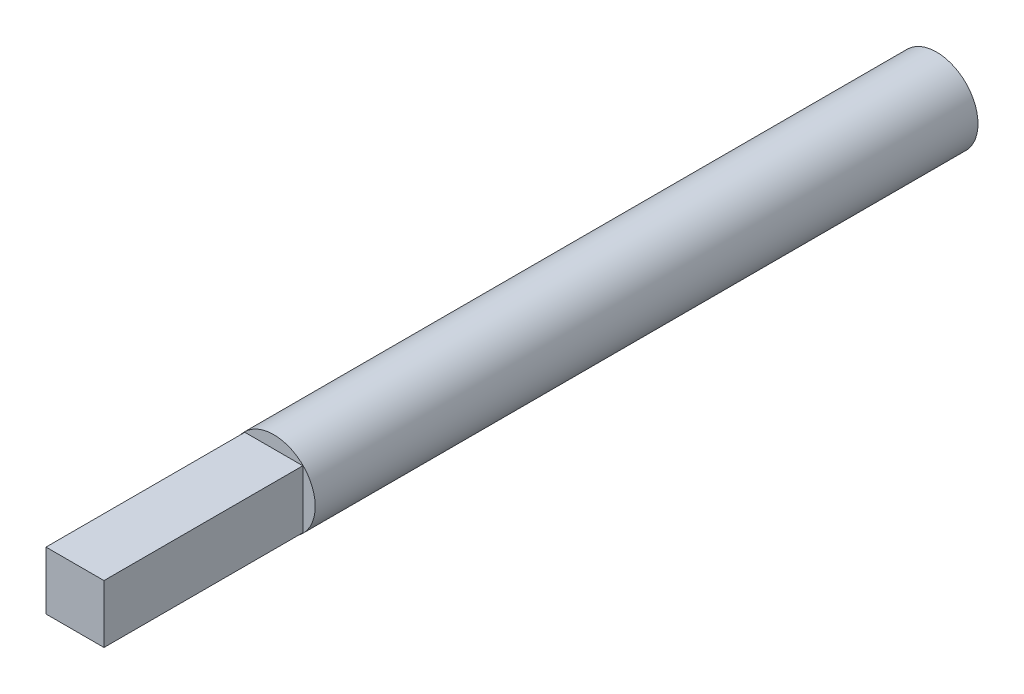
ISO-10303-21;
HEADER;
FILE_DESCRIPTION(('STEP AP214'),'2;1');
FILE_NAME('part.step','',(''),(''),'','','');
FILE_SCHEMA(('AUTOMOTIVE_DESIGN { 1 0 10303 214 1 1 1 1 }'));
ENDSEC;
DATA;
#1=APPLICATION_CONTEXT('core data for automotive mechanical design processes');
#2=APPLICATION_PROTOCOL_DEFINITION('international standard','automotive_design',2000,#1);
#3=PRODUCT_CONTEXT('',#1,'mechanical');
#4=PRODUCT('Part','Part','',(#3));
#5=PRODUCT_RELATED_PRODUCT_CATEGORY('part','',(#4));
#6=PRODUCT_DEFINITION_FORMATION('','',#4);
#7=PRODUCT_DEFINITION_CONTEXT('part definition',#1,'design');
#8=PRODUCT_DEFINITION('design','',#6,#7);
#9=PRODUCT_DEFINITION_SHAPE('','',#8);
#10=(LENGTH_UNIT() NAMED_UNIT(*) SI_UNIT(.MILLI.,.METRE.));
#11=(NAMED_UNIT(*) PLANE_ANGLE_UNIT() SI_UNIT($,.RADIAN.));
#12=(NAMED_UNIT(*) SI_UNIT($,.STERADIAN.) SOLID_ANGLE_UNIT());
#13=UNCERTAINTY_MEASURE_WITH_UNIT(LENGTH_MEASURE(1.E-05),#10,'distance_accuracy_value','');
#14=(GEOMETRIC_REPRESENTATION_CONTEXT(3) GLOBAL_UNCERTAINTY_ASSIGNED_CONTEXT((#13)) GLOBAL_UNIT_ASSIGNED_CONTEXT((#10,
#11,#12)) REPRESENTATION_CONTEXT('',''));
#15=CARTESIAN_POINT('',(0.,0.,0.));
#16=DIRECTION('',(0.,0.,1.));
#17=DIRECTION('',(1.,0.,0.));
#18=AXIS2_PLACEMENT_3D('',#15,#16,#17);
#19=CARTESIAN_POINT('',(0.,0.,5.));
#20=DIRECTION('',(0.,0.,-1.));
#21=DIRECTION('',(-1.,0.,0.));
#22=AXIS2_PLACEMENT_3D('',#19,#20,#21);
#23=CYLINDRICAL_SURFACE('',#22,1.25);
#24=CARTESIAN_POINT('',(0.,0.,5.));
#25=DIRECTION('',(0.,0.,1.));
#26=DIRECTION('',(1.,0.,0.));
#27=AXIS2_PLACEMENT_3D('',#24,#25,#26);
#28=CIRCLE('',#27,1.25);
#29=CARTESIAN_POINT('',(1.25,0.,5.));
#30=VERTEX_POINT('',#29);
#31=EDGE_CURVE('E11',#30,#30,#28,.T.);
#32=ORIENTED_EDGE('',*,*,#31,.F.);
#33=EDGE_LOOP('',(#32));
#34=FACE_BOUND('',#33,.T.);
#35=CARTESIAN_POINT('',(0.,0.,-15.));
#36=DIRECTION('',(0.,0.,1.));
#37=DIRECTION('',(1.,0.,0.));
#38=AXIS2_PLACEMENT_3D('',#35,#36,#37);
#39=CIRCLE('',#38,1.25);
#40=CARTESIAN_POINT('',(1.25,0.,-15.));
#41=VERTEX_POINT('',#40);
#42=EDGE_CURVE('E126',#41,#41,#39,.T.);
#43=ORIENTED_EDGE('',*,*,#42,.T.);
#44=EDGE_LOOP('',(#43));
#45=FACE_BOUND('',#44,.T.);
#46=ADVANCED_FACE('F43',(#34,#45),#23,.T.);
#47=CARTESIAN_POINT('',(0.,0.,5.));
#48=DIRECTION('',(0.,0.,1.));
#49=DIRECTION('',(1.,0.,0.));
#50=AXIS2_PLACEMENT_3D('',#47,#48,#49);
#51=PLANE('',#50);
#52=DIRECTION('',(0.,1.,0.));
#53=VECTOR('',#52,1.);
#54=CARTESIAN_POINT('',(0.875,-0.875,5.));
#55=LINE('',#54,#53);
#56=CARTESIAN_POINT('',(0.875,-0.875,5.));
#57=VERTEX_POINT('',#56);
#58=CARTESIAN_POINT('',(0.875,0.875,5.));
#59=VERTEX_POINT('',#58);
#60=EDGE_CURVE('E58',#57,#59,#55,.T.);
#61=ORIENTED_EDGE('',*,*,#60,.F.);
#62=DIRECTION('',(1.,0.,0.));
#63=VECTOR('',#62,1.);
#64=CARTESIAN_POINT('',(-0.875,-0.875,5.));
#65=LINE('',#64,#63);
#66=CARTESIAN_POINT('',(-0.875,-0.875,5.));
#67=VERTEX_POINT('',#66);
#68=EDGE_CURVE('E62',#67,#57,#65,.T.);
#69=ORIENTED_EDGE('',*,*,#68,.F.);
#70=DIRECTION('',(0.,-1.,0.));
#71=VECTOR('',#70,1.);
#72=CARTESIAN_POINT('',(-0.875,-0.875,5.));
#73=LINE('',#72,#71);
#74=CARTESIAN_POINT('',(-0.875,0.875,5.));
#75=VERTEX_POINT('',#74);
#76=EDGE_CURVE('E118',#75,#67,#73,.T.);
#77=ORIENTED_EDGE('',*,*,#76,.F.);
#78=DIRECTION('',(-1.,0.,0.));
#79=VECTOR('',#78,1.);
#80=CARTESIAN_POINT('',(-0.875,0.875,5.));
#81=LINE('',#80,#79);
#82=EDGE_CURVE('E121',#59,#75,#81,.T.);
#83=ORIENTED_EDGE('',*,*,#82,.F.);
#84=EDGE_LOOP('',(#61,#69,#77,#83));
#85=FACE_BOUND('',#84,.T.);
#86=ORIENTED_EDGE('',*,*,#31,.T.);
#87=EDGE_LOOP('',(#86));
#88=FACE_BOUND('',#87,.T.);
#89=ADVANCED_FACE('F145',(#85,#88),#51,.T.);
#90=CARTESIAN_POINT('',(0.875,-0.875,11.));
#91=DIRECTION('',(-1.,0.,0.));
#92=DIRECTION('',(0.,0.,1.));
#93=AXIS2_PLACEMENT_3D('',#90,#91,#92);
#94=PLANE('',#93);
#95=ORIENTED_EDGE('',*,*,#60,.T.);
#96=DIRECTION('',(0.,0.,-1.));
#97=VECTOR('',#96,1.);
#98=CARTESIAN_POINT('',(0.875,0.875,11.));
#99=LINE('',#98,#97);
#100=CARTESIAN_POINT('',(0.875,0.875,11.));
#101=VERTEX_POINT('',#100);
#102=EDGE_CURVE('E51',#101,#59,#99,.T.);
#103=ORIENTED_EDGE('',*,*,#102,.F.);
#104=DIRECTION('',(0.,1.,0.));
#105=VECTOR('',#104,1.);
#106=CARTESIAN_POINT('',(0.875,-0.875,11.));
#107=LINE('',#106,#105);
#108=CARTESIAN_POINT('',(0.875,-0.875,11.));
#109=VERTEX_POINT('',#108);
#110=EDGE_CURVE('E93',#109,#101,#107,.T.);
#111=ORIENTED_EDGE('',*,*,#110,.F.);
#112=DIRECTION('',(0.,0.,-1.));
#113=VECTOR('',#112,1.);
#114=CARTESIAN_POINT('',(0.875,-0.875,11.));
#115=LINE('',#114,#113);
#116=EDGE_CURVE('E113',#109,#57,#115,.T.);
#117=ORIENTED_EDGE('',*,*,#116,.T.);
#118=EDGE_LOOP('',(#95,#103,#111,#117));
#119=FACE_BOUND('',#118,.T.);
#120=ADVANCED_FACE('F104',(#119),#94,.F.);
#121=CARTESIAN_POINT('',(-0.875,0.875,11.));
#122=DIRECTION('',(0.,-1.,0.));
#123=DIRECTION('',(0.,0.,-1.));
#124=AXIS2_PLACEMENT_3D('',#121,#122,#123);
#125=PLANE('',#124);
#126=ORIENTED_EDGE('',*,*,#82,.T.);
#127=DIRECTION('',(0.,0.,-1.));
#128=VECTOR('',#127,1.);
#129=CARTESIAN_POINT('',(-0.875,0.875,11.));
#130=LINE('',#129,#128);
#131=CARTESIAN_POINT('',(-0.875,0.875,11.));
#132=VERTEX_POINT('',#131);
#133=EDGE_CURVE('E88',#132,#75,#130,.T.);
#134=ORIENTED_EDGE('',*,*,#133,.F.);
#135=DIRECTION('',(-1.,0.,0.));
#136=VECTOR('',#135,1.);
#137=CARTESIAN_POINT('',(-0.875,0.875,11.));
#138=LINE('',#137,#136);
#139=EDGE_CURVE('E82',#101,#132,#138,.T.);
#140=ORIENTED_EDGE('',*,*,#139,.F.);
#141=ORIENTED_EDGE('',*,*,#102,.T.);
#142=EDGE_LOOP('',(#126,#134,#140,#141));
#143=FACE_BOUND('',#142,.T.);
#144=ADVANCED_FACE('F85',(#143),#125,.F.);
#145=CARTESIAN_POINT('',(-0.875,-0.875,11.));
#146=DIRECTION('',(1.,0.,0.));
#147=DIRECTION('',(0.,0.,-1.));
#148=AXIS2_PLACEMENT_3D('',#145,#146,#147);
#149=PLANE('',#148);
#150=ORIENTED_EDGE('',*,*,#76,.T.);
#151=DIRECTION('',(0.,0.,-1.));
#152=VECTOR('',#151,1.);
#153=CARTESIAN_POINT('',(-0.875,-0.875,11.));
#154=LINE('',#153,#152);
#155=CARTESIAN_POINT('',(-0.875,-0.875,11.));
#156=VERTEX_POINT('',#155);
#157=EDGE_CURVE('E107',#156,#67,#154,.T.);
#158=ORIENTED_EDGE('',*,*,#157,.F.);
#159=DIRECTION('',(0.,-1.,0.));
#160=VECTOR('',#159,1.);
#161=CARTESIAN_POINT('',(-0.875,-0.875,11.));
#162=LINE('',#161,#160);
#163=EDGE_CURVE('E92',#132,#156,#162,.T.);
#164=ORIENTED_EDGE('',*,*,#163,.F.);
#165=ORIENTED_EDGE('',*,*,#133,.T.);
#166=EDGE_LOOP('',(#150,#158,#164,#165));
#167=FACE_BOUND('',#166,.T.);
#168=ADVANCED_FACE('F159',(#167),#149,.F.);
#169=CARTESIAN_POINT('',(-0.875,-0.875,11.));
#170=DIRECTION('',(0.,1.,0.));
#171=DIRECTION('',(0.,0.,1.));
#172=AXIS2_PLACEMENT_3D('',#169,#170,#171);
#173=PLANE('',#172);
#174=ORIENTED_EDGE('',*,*,#68,.T.);
#175=ORIENTED_EDGE('',*,*,#116,.F.);
#176=DIRECTION('',(1.,0.,0.));
#177=VECTOR('',#176,1.);
#178=CARTESIAN_POINT('',(-0.875,-0.875,11.));
#179=LINE('',#178,#177);
#180=EDGE_CURVE('E98',#156,#109,#179,.T.);
#181=ORIENTED_EDGE('',*,*,#180,.F.);
#182=ORIENTED_EDGE('',*,*,#157,.T.);
#183=EDGE_LOOP('',(#174,#175,#181,#182));
#184=FACE_BOUND('',#183,.T.);
#185=ADVANCED_FACE('F142',(#184),#173,.F.);
#186=CARTESIAN_POINT('',(0.,0.,11.));
#187=DIRECTION('',(0.,0.,-1.));
#188=DIRECTION('',(-1.,0.,0.));
#189=AXIS2_PLACEMENT_3D('',#186,#187,#188);
#190=PLANE('',#189);
#191=ORIENTED_EDGE('',*,*,#110,.T.);
#192=ORIENTED_EDGE('',*,*,#139,.T.);
#193=ORIENTED_EDGE('',*,*,#163,.T.);
#194=ORIENTED_EDGE('',*,*,#180,.T.);
#195=EDGE_LOOP('',(#191,#192,#193,#194));
#196=FACE_BOUND('',#195,.T.);
#197=ADVANCED_FACE('F96',(#196),#190,.F.);
#198=CARTESIAN_POINT('',(0.,0.,-15.));
#199=DIRECTION('',(0.,0.,1.));
#200=DIRECTION('',(1.,0.,0.));
#201=AXIS2_PLACEMENT_3D('',#198,#199,#200);
#202=PLANE('',#201);
#203=ORIENTED_EDGE('',*,*,#42,.F.);
#204=EDGE_LOOP('',(#203));
#205=FACE_BOUND('',#204,.T.);
#206=ADVANCED_FACE('F136',(#205),#202,.F.);
#207=CLOSED_SHELL('',(#46,#89,#120,#144,#168,#185,#197,#206));
#208=MANIFOLD_SOLID_BREP('B2',#207);
#209=ADVANCED_BREP_SHAPE_REPRESENTATION('',(#18,#208),#14);
#210=SHAPE_DEFINITION_REPRESENTATION(#9,#209);
ENDSEC;
END-ISO-10303-21;
